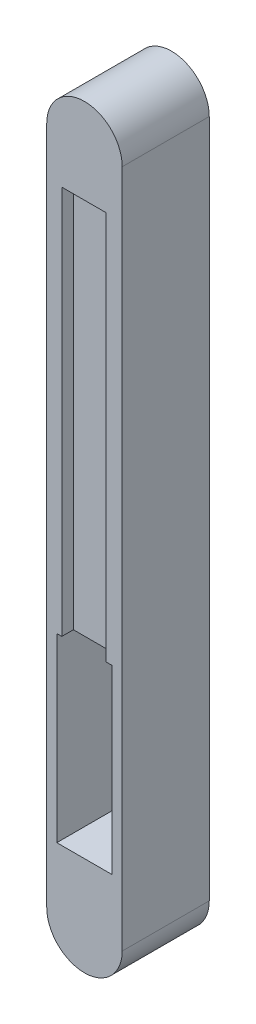
ISO-10303-21;
HEADER;
FILE_DESCRIPTION(('STEP AP214'),'2;1');
FILE_NAME('part.step','',(''),(''),'','','');
FILE_SCHEMA(('AUTOMOTIVE_DESIGN { 1 0 10303 214 1 1 1 1 }'));
ENDSEC;
DATA;
#1=APPLICATION_CONTEXT('core data for automotive mechanical design processes');
#2=APPLICATION_PROTOCOL_DEFINITION('international standard','automotive_design',2000,#1);
#3=PRODUCT_CONTEXT('',#1,'mechanical');
#4=PRODUCT('Part','Part','',(#3));
#5=PRODUCT_RELATED_PRODUCT_CATEGORY('part','',(#4));
#6=PRODUCT_DEFINITION_FORMATION('','',#4);
#7=PRODUCT_DEFINITION_CONTEXT('part definition',#1,'design');
#8=PRODUCT_DEFINITION('design','',#6,#7);
#9=PRODUCT_DEFINITION_SHAPE('','',#8);
#10=(LENGTH_UNIT() NAMED_UNIT(*) SI_UNIT(.MILLI.,.METRE.));
#11=(NAMED_UNIT(*) PLANE_ANGLE_UNIT() SI_UNIT($,.RADIAN.));
#12=(NAMED_UNIT(*) SI_UNIT($,.STERADIAN.) SOLID_ANGLE_UNIT());
#13=UNCERTAINTY_MEASURE_WITH_UNIT(LENGTH_MEASURE(1.E-05),#10,'distance_accuracy_value','');
#14=(GEOMETRIC_REPRESENTATION_CONTEXT(3) GLOBAL_UNCERTAINTY_ASSIGNED_CONTEXT((#13)) GLOBAL_UNIT_ASSIGNED_CONTEXT((#10,
#11,#12)) REPRESENTATION_CONTEXT('',''));
#15=CARTESIAN_POINT('',(0.,0.,0.));
#16=DIRECTION('',(0.,0.,1.));
#17=DIRECTION('',(1.,0.,0.));
#18=AXIS2_PLACEMENT_3D('',#15,#16,#17);
#19=CARTESIAN_POINT('',(-4.4030818648567,46.7518362911079,15.));
#20=DIRECTION('',(-1.,0.,0.));
#21=DIRECTION('',(0.,-1.,0.));
#22=AXIS2_PLACEMENT_3D('',#19,#20,#21);
#23=PLANE('',#22);
#24=DIRECTION('',(0.,0.,1.));
#25=VECTOR('',#24,1.);
#26=CARTESIAN_POINT('',(-4.4030818648567,46.7518362911079,15.));
#27=LINE('',#26,#25);
#28=CARTESIAN_POINT('',(-4.4030818648567,46.7518362911079,15.));
#29=VERTEX_POINT('',#28);
#30=CARTESIAN_POINT('',(-4.4030818648567,46.7518362911079,17.2993525225217));
#31=VERTEX_POINT('',#30);
#32=EDGE_CURVE('E198',#29,#31,#27,.T.);
#33=ORIENTED_EDGE('',*,*,#32,.T.);
#34=DIRECTION('',(0.,-1.,0.));
#35=VECTOR('',#34,1.);
#36=CARTESIAN_POINT('',(-4.4030818648567,46.7518362911079,17.2993525225217));
#37=LINE('',#36,#35);
#38=CARTESIAN_POINT('',(-4.40308186485671,-30.5781994450934,17.2993525225217));
#39=VERTEX_POINT('',#38);
#40=EDGE_CURVE('E275',#31,#39,#37,.T.);
#41=ORIENTED_EDGE('',*,*,#40,.T.);
#42=DIRECTION('',(0.,0.,1.));
#43=VECTOR('',#42,1.);
#44=CARTESIAN_POINT('',(-4.40308186485671,-30.5781994450934,40.));
#45=LINE('',#44,#43);
#46=CARTESIAN_POINT('',(-4.40308186485672,-30.5781994450934,15.));
#47=VERTEX_POINT('',#46);
#48=EDGE_CURVE('E206',#47,#39,#45,.T.);
#49=ORIENTED_EDGE('',*,*,#48,.F.);
#50=DIRECTION('',(0.,-1.,0.));
#51=VECTOR('',#50,1.);
#52=CARTESIAN_POINT('',(-4.40308186485671,-46.7518362911079,15.));
#53=LINE('',#52,#51);
#54=EDGE_CURVE('E142',#29,#47,#53,.T.);
#55=ORIENTED_EDGE('',*,*,#54,.F.);
#56=EDGE_LOOP('',(#33,#41,#49,#55));
#57=FACE_BOUND('',#56,.T.);
#58=ADVANCED_FACE('F45',(#57),#23,.F.);
#59=CARTESIAN_POINT('',(4.4030818648567,46.7518362911079,15.));
#60=DIRECTION('',(1.,0.,0.));
#61=DIRECTION('',(0.,1.,0.));
#62=AXIS2_PLACEMENT_3D('',#59,#60,#61);
#63=PLANE('',#62);
#64=DIRECTION('',(0.,0.,-1.));
#65=VECTOR('',#64,1.);
#66=CARTESIAN_POINT('',(4.40308186485671,-30.5781994450934,40.));
#67=LINE('',#66,#65);
#68=CARTESIAN_POINT('',(4.40308186485671,-30.5781994450934,17.2993525225217));
#69=VERTEX_POINT('',#68);
#70=CARTESIAN_POINT('',(4.40308186485672,-30.5781994450934,15.));
#71=VERTEX_POINT('',#70);
#72=EDGE_CURVE('E186',#69,#71,#67,.T.);
#73=ORIENTED_EDGE('',*,*,#72,.F.);
#74=DIRECTION('',(0.,1.,0.));
#75=VECTOR('',#74,1.);
#76=CARTESIAN_POINT('',(4.4030818648567,46.7518362911079,17.2993525225217));
#77=LINE('',#76,#75);
#78=CARTESIAN_POINT('',(4.4030818648567,46.7518362911079,17.2993525225217));
#79=VERTEX_POINT('',#78);
#80=EDGE_CURVE('E265',#69,#79,#77,.T.);
#81=ORIENTED_EDGE('',*,*,#80,.T.);
#82=DIRECTION('',(0.,0.,1.));
#83=VECTOR('',#82,1.);
#84=CARTESIAN_POINT('',(4.4030818648567,46.7518362911079,15.));
#85=LINE('',#84,#83);
#86=CARTESIAN_POINT('',(4.4030818648567,46.7518362911079,15.));
#87=VERTEX_POINT('',#86);
#88=EDGE_CURVE('E188',#87,#79,#85,.T.);
#89=ORIENTED_EDGE('',*,*,#88,.F.);
#90=DIRECTION('',(0.,1.,0.));
#91=VECTOR('',#90,1.);
#92=CARTESIAN_POINT('',(4.40308186485671,-46.7518362911079,15.));
#93=LINE('',#92,#91);
#94=EDGE_CURVE('E178',#71,#87,#93,.T.);
#95=ORIENTED_EDGE('',*,*,#94,.F.);
#96=EDGE_LOOP('',(#73,#81,#89,#95));
#97=FACE_BOUND('',#96,.T.);
#98=ADVANCED_FACE('F184',(#97),#63,.F.);
#99=CARTESIAN_POINT('',(4.4030818648567,46.7518362911079,15.));
#100=DIRECTION('',(0.,1.,0.));
#101=DIRECTION('',(0.,0.,1.));
#102=AXIS2_PLACEMENT_3D('',#99,#100,#101);
#103=PLANE('',#102);
#104=ORIENTED_EDGE('',*,*,#88,.T.);
#105=DIRECTION('',(-1.,0.,0.));
#106=VECTOR('',#105,1.);
#107=CARTESIAN_POINT('',(4.4030818648567,46.7518362911079,17.2993525225217));
#108=LINE('',#107,#106);
#109=EDGE_CURVE('E270',#79,#31,#108,.T.);
#110=ORIENTED_EDGE('',*,*,#109,.T.);
#111=ORIENTED_EDGE('',*,*,#32,.F.);
#112=DIRECTION('',(-1.,0.,0.));
#113=VECTOR('',#112,1.);
#114=CARTESIAN_POINT('',(4.4030818648567,46.7518362911079,15.));
#115=LINE('',#114,#113);
#116=EDGE_CURVE('E191',#87,#29,#115,.T.);
#117=ORIENTED_EDGE('',*,*,#116,.F.);
#118=EDGE_LOOP('',(#104,#110,#111,#117));
#119=FACE_BOUND('',#118,.T.);
#120=ADVANCED_FACE('F306',(#119),#103,.F.);
#121=CARTESIAN_POINT('',(-7.40308186485673,56.2618005549066,135.));
#122=DIRECTION('',(1.,0.,0.));
#123=DIRECTION('',(0.,1.,0.));
#124=AXIS2_PLACEMENT_3D('',#121,#122,#123);
#125=PLANE('',#124);
#126=DIRECTION('',(0.,0.,-1.));
#127=VECTOR('',#126,1.);
#128=CARTESIAN_POINT('',(-7.40308186485672,-78.7381994450934,135.));
#129=LINE('',#128,#127);
#130=CARTESIAN_POINT('',(-7.40308186485672,-78.7381994450934,17.2993525225217));
#131=VERTEX_POINT('',#130);
#132=CARTESIAN_POINT('',(-7.40308186485672,-78.7381994450934,0.));
#133=VERTEX_POINT('',#132);
#134=EDGE_CURVE('E161',#131,#133,#129,.T.);
#135=ORIENTED_EDGE('',*,*,#134,.F.);
#136=DIRECTION('',(0.,1.,0.));
#137=VECTOR('',#136,1.);
#138=CARTESIAN_POINT('',(-7.40308186485673,56.2618005549066,17.2993525225217));
#139=LINE('',#138,#137);
#140=CARTESIAN_POINT('',(-7.40308186485673,56.2618005549066,17.2993525225217));
#141=VERTEX_POINT('',#140);
#142=EDGE_CURVE('E143',#131,#141,#139,.T.);
#143=ORIENTED_EDGE('',*,*,#142,.T.);
#144=DIRECTION('',(0.,0.,-1.));
#145=VECTOR('',#144,1.);
#146=CARTESIAN_POINT('',(-7.40308186485673,56.2618005549066,135.));
#147=LINE('',#146,#145);
#148=CARTESIAN_POINT('',(-7.40308186485673,56.2618005549066,0.));
#149=VERTEX_POINT('',#148);
#150=EDGE_CURVE('E139',#141,#149,#147,.T.);
#151=ORIENTED_EDGE('',*,*,#150,.T.);
#152=DIRECTION('',(0.,-1.,0.));
#153=VECTOR('',#152,1.);
#154=CARTESIAN_POINT('',(-7.40308186485673,56.2618005549066,0.));
#155=LINE('',#154,#153);
#156=EDGE_CURVE('E248',#149,#133,#155,.T.);
#157=ORIENTED_EDGE('',*,*,#156,.T.);
#158=EDGE_LOOP('',(#135,#143,#151,#157));
#159=FACE_BOUND('',#158,.T.);
#160=ADVANCED_FACE('F261',(#159),#125,.F.);
#161=CARTESIAN_POINT('',(0.0969181351432745,56.2618005549066,135.));
#162=DIRECTION('',(0.,0.,-1.));
#163=DIRECTION('',(-1.,0.,0.));
#164=AXIS2_PLACEMENT_3D('',#161,#162,#163);
#165=CYLINDRICAL_SURFACE('',#164,7.5);
#166=CARTESIAN_POINT('',(0.0969181351432745,56.2618005549066,17.2993525225217));
#167=DIRECTION('',(0.,0.,-1.));
#168=DIRECTION('',(-1.,0.,0.));
#169=AXIS2_PLACEMENT_3D('',#166,#167,#168);
#170=CIRCLE('',#169,7.5);
#171=CARTESIAN_POINT('',(7.59691813514327,56.2618005549066,17.2993525225217));
#172=VERTEX_POINT('',#171);
#173=EDGE_CURVE('E134',#141,#172,#170,.T.);
#174=ORIENTED_EDGE('',*,*,#173,.T.);
#175=DIRECTION('',(0.,0.,-1.));
#176=VECTOR('',#175,1.);
#177=CARTESIAN_POINT('',(7.59691813514327,56.2618005549066,135.));
#178=LINE('',#177,#176);
#179=CARTESIAN_POINT('',(7.59691813514327,56.2618005549066,0.));
#180=VERTEX_POINT('',#179);
#181=EDGE_CURVE('E137',#172,#180,#178,.T.);
#182=ORIENTED_EDGE('',*,*,#181,.T.);
#183=CARTESIAN_POINT('',(0.0969181351432745,56.2618005549066,0.));
#184=DIRECTION('',(0.,0.,1.));
#185=DIRECTION('',(1.,0.,0.));
#186=AXIS2_PLACEMENT_3D('',#183,#184,#185);
#187=CIRCLE('',#186,7.5);
#188=EDGE_CURVE('E242',#180,#149,#187,.T.);
#189=ORIENTED_EDGE('',*,*,#188,.T.);
#190=ORIENTED_EDGE('',*,*,#150,.F.);
#191=EDGE_LOOP('',(#174,#182,#189,#190));
#192=FACE_BOUND('',#191,.T.);
#193=ADVANCED_FACE('F47',(#192),#165,.T.);
#194=CARTESIAN_POINT('',(0.0969181351432745,-78.7381994450934,135.));
#195=DIRECTION('',(0.,0.,-1.));
#196=DIRECTION('',(-1.,0.,0.));
#197=AXIS2_PLACEMENT_3D('',#194,#195,#196);
#198=CYLINDRICAL_SURFACE('',#197,7.5);
#199=DIRECTION('',(0.,0.,-1.));
#200=VECTOR('',#199,1.);
#201=CARTESIAN_POINT('',(7.59691813514327,-78.7381994450934,135.));
#202=LINE('',#201,#200);
#203=CARTESIAN_POINT('',(7.59691813514327,-78.7381994450934,17.2993525225217));
#204=VERTEX_POINT('',#203);
#205=CARTESIAN_POINT('',(7.59691813514327,-78.7381994450934,0.));
#206=VERTEX_POINT('',#205);
#207=EDGE_CURVE('E157',#204,#206,#202,.T.);
#208=ORIENTED_EDGE('',*,*,#207,.F.);
#209=CARTESIAN_POINT('',(0.0969181351432745,-78.7381994450934,17.2993525225217));
#210=DIRECTION('',(0.,0.,-1.));
#211=DIRECTION('',(-1.,0.,0.));
#212=AXIS2_PLACEMENT_3D('',#209,#210,#211);
#213=CIRCLE('',#212,7.5);
#214=EDGE_CURVE('E61',#204,#131,#213,.T.);
#215=ORIENTED_EDGE('',*,*,#214,.T.);
#216=ORIENTED_EDGE('',*,*,#134,.T.);
#217=CARTESIAN_POINT('',(0.0969181351432745,-78.7381994450934,0.));
#218=DIRECTION('',(0.,0.,1.));
#219=DIRECTION('',(-1.,0.,0.));
#220=AXIS2_PLACEMENT_3D('',#217,#218,#219);
#221=CIRCLE('',#220,7.5);
#222=EDGE_CURVE('E163',#133,#206,#221,.T.);
#223=ORIENTED_EDGE('',*,*,#222,.T.);
#224=EDGE_LOOP('',(#208,#215,#216,#223));
#225=FACE_BOUND('',#224,.T.);
#226=ADVANCED_FACE('F255',(#225),#198,.T.);
#227=CARTESIAN_POINT('',(7.59691813514327,56.2618005549066,135.));
#228=DIRECTION('',(-1.,0.,0.));
#229=DIRECTION('',(0.,-1.,0.));
#230=AXIS2_PLACEMENT_3D('',#227,#228,#229);
#231=PLANE('',#230);
#232=ORIENTED_EDGE('',*,*,#181,.F.);
#233=DIRECTION('',(0.,1.,0.));
#234=VECTOR('',#233,1.);
#235=CARTESIAN_POINT('',(7.59691813514327,63.7618005549066,17.2993525225217));
#236=LINE('',#235,#234);
#237=EDGE_CURVE('E145',#204,#172,#236,.T.);
#238=ORIENTED_EDGE('',*,*,#237,.F.);
#239=ORIENTED_EDGE('',*,*,#207,.T.);
#240=DIRECTION('',(0.,1.,0.));
#241=VECTOR('',#240,1.);
#242=CARTESIAN_POINT('',(7.59691813514327,56.2618005549066,0.));
#243=LINE('',#242,#241);
#244=EDGE_CURVE('E154',#206,#180,#243,.T.);
#245=ORIENTED_EDGE('',*,*,#244,.T.);
#246=EDGE_LOOP('',(#232,#238,#239,#245));
#247=FACE_BOUND('',#246,.T.);
#248=ADVANCED_FACE('F152',(#247),#231,.F.);
#249=CARTESIAN_POINT('',(0.0969181351432745,56.2618005549066,0.));
#250=DIRECTION('',(0.,0.,1.));
#251=DIRECTION('',(1.,0.,0.));
#252=AXIS2_PLACEMENT_3D('',#249,#250,#251);
#253=PLANE('',#252);
#254=DIRECTION('',(-1.,0.,0.));
#255=VECTOR('',#254,1.);
#256=CARTESIAN_POINT('',(5.59691813514327,-66.5781994450934,0.));
#257=LINE('',#256,#255);
#258=CARTESIAN_POINT('',(5.59691813514327,-66.5781994450934,0.));
#259=VERTEX_POINT('',#258);
#260=CARTESIAN_POINT('',(-5.40308186485673,-66.5781994450934,0.));
#261=VERTEX_POINT('',#260);
#262=EDGE_CURVE('E213',#259,#261,#257,.T.);
#263=ORIENTED_EDGE('',*,*,#262,.F.);
#264=DIRECTION('',(0.,-1.,0.));
#265=VECTOR('',#264,1.);
#266=CARTESIAN_POINT('',(5.59691813514327,-66.5781994450934,0.));
#267=LINE('',#266,#265);
#268=CARTESIAN_POINT('',(5.59691813514327,-30.5781994450934,0.));
#269=VERTEX_POINT('',#268);
#270=EDGE_CURVE('E209',#269,#259,#267,.T.);
#271=ORIENTED_EDGE('',*,*,#270,.F.);
#272=DIRECTION('',(1.,0.,0.));
#273=VECTOR('',#272,1.);
#274=CARTESIAN_POINT('',(-5.40308186485673,-30.5781994450934,0.));
#275=LINE('',#274,#273);
#276=CARTESIAN_POINT('',(-5.40308186485673,-30.5781994450934,0.));
#277=VERTEX_POINT('',#276);
#278=EDGE_CURVE('E221',#277,#269,#275,.T.);
#279=ORIENTED_EDGE('',*,*,#278,.F.);
#280=DIRECTION('',(0.,1.,0.));
#281=VECTOR('',#280,1.);
#282=CARTESIAN_POINT('',(-5.40308186485673,-66.5781994450934,0.));
#283=LINE('',#282,#281);
#284=EDGE_CURVE('E217',#261,#277,#283,.T.);
#285=ORIENTED_EDGE('',*,*,#284,.F.);
#286=EDGE_LOOP('',(#263,#271,#279,#285));
#287=FACE_BOUND('',#286,.T.);
#288=CARTESIAN_POINT('',(0.0969181351432743,54.7618005549066,0.));
#289=DIRECTION('',(0.,0.,-1.));
#290=DIRECTION('',(-1.,0.,0.));
#291=AXIS2_PLACEMENT_3D('',#288,#289,#290);
#292=CIRCLE('',#291,3.5);
#293=CARTESIAN_POINT('',(-3.40308186485673,54.7618005549066,0.));
#294=VERTEX_POINT('',#293);
#295=EDGE_CURVE('E229',#294,#294,#292,.T.);
#296=ORIENTED_EDGE('',*,*,#295,.F.);
#297=EDGE_LOOP('',(#296));
#298=FACE_BOUND('',#297,.T.);
#299=ORIENTED_EDGE('',*,*,#188,.F.);
#300=ORIENTED_EDGE('',*,*,#244,.F.);
#301=ORIENTED_EDGE('',*,*,#222,.F.);
#302=ORIENTED_EDGE('',*,*,#156,.F.);
#303=EDGE_LOOP('',(#299,#300,#301,#302));
#304=FACE_BOUND('',#303,.T.);
#305=ADVANCED_FACE('F259',(#287,#298,#304),#253,.F.);
#306=CARTESIAN_POINT('',(0.0969181351432743,54.7618005549066,10.));
#307=DIRECTION('',(0.,0.,-1.));
#308=DIRECTION('',(-1.,0.,0.));
#309=AXIS2_PLACEMENT_3D('',#306,#307,#308);
#310=CYLINDRICAL_SURFACE('',#309,3.5);
#311=CARTESIAN_POINT('',(0.0969181351432743,54.7618005549066,10.));
#312=DIRECTION('',(0.,0.,-1.));
#313=DIRECTION('',(-1.,0.,0.));
#314=AXIS2_PLACEMENT_3D('',#311,#312,#313);
#315=CIRCLE('',#314,3.5);
#316=CARTESIAN_POINT('',(-3.40308186485673,54.7618005549066,10.));
#317=VERTEX_POINT('',#316);
#318=EDGE_CURVE('E238',#317,#317,#315,.T.);
#319=ORIENTED_EDGE('',*,*,#318,.F.);
#320=EDGE_LOOP('',(#319));
#321=FACE_BOUND('',#320,.T.);
#322=ORIENTED_EDGE('',*,*,#295,.T.);
#323=EDGE_LOOP('',(#322));
#324=FACE_BOUND('',#323,.T.);
#325=ADVANCED_FACE('F319',(#321,#324),#310,.F.);
#326=CARTESIAN_POINT('',(0.0969181351432743,54.7618005549066,10.));
#327=DIRECTION('',(0.,0.,-1.));
#328=DIRECTION('',(-1.,0.,0.));
#329=AXIS2_PLACEMENT_3D('',#326,#327,#328);
#330=PLANE('',#329);
#331=ORIENTED_EDGE('',*,*,#318,.T.);
#332=EDGE_LOOP('',(#331));
#333=FACE_BOUND('',#332,.T.);
#334=ADVANCED_FACE('F311',(#333),#330,.T.);
#335=CARTESIAN_POINT('',(5.59691813514327,-66.5781994450934,40.));
#336=DIRECTION('',(1.,0.,0.));
#337=DIRECTION('',(0.,1.,0.));
#338=AXIS2_PLACEMENT_3D('',#335,#336,#337);
#339=PLANE('',#338);
#340=DIRECTION('',(0.,0.,-1.));
#341=VECTOR('',#340,1.);
#342=CARTESIAN_POINT('',(5.59691813514327,-66.5781994450934,40.));
#343=LINE('',#342,#341);
#344=CARTESIAN_POINT('',(5.59691813514327,-66.5781994450934,17.2993525225217));
#345=VERTEX_POINT('',#344);
#346=EDGE_CURVE('E225',#345,#259,#343,.T.);
#347=ORIENTED_EDGE('',*,*,#346,.F.);
#348=DIRECTION('',(0.,1.,0.));
#349=VECTOR('',#348,1.);
#350=CARTESIAN_POINT('',(5.59691813514327,-66.5781994450934,17.2993525225217));
#351=LINE('',#350,#349);
#352=CARTESIAN_POINT('',(5.59691813514327,-30.5781994450934,17.2993525225217));
#353=VERTEX_POINT('',#352);
#354=EDGE_CURVE('E69',#345,#353,#351,.T.);
#355=ORIENTED_EDGE('',*,*,#354,.T.);
#356=DIRECTION('',(0.,0.,-1.));
#357=VECTOR('',#356,1.);
#358=CARTESIAN_POINT('',(5.59691813514327,-30.5781994450934,40.));
#359=LINE('',#358,#357);
#360=EDGE_CURVE('E226',#353,#269,#359,.T.);
#361=ORIENTED_EDGE('',*,*,#360,.T.);
#362=ORIENTED_EDGE('',*,*,#270,.T.);
#363=EDGE_LOOP('',(#347,#355,#361,#362));
#364=FACE_BOUND('',#363,.T.);
#365=ADVANCED_FACE('F309',(#364),#339,.F.);
#366=CARTESIAN_POINT('',(-5.40308186485673,-30.5781994450934,40.));
#367=DIRECTION('',(0.,1.,0.));
#368=DIRECTION('',(0.,0.,1.));
#369=AXIS2_PLACEMENT_3D('',#366,#367,#368);
#370=PLANE('',#369);
#371=ORIENTED_EDGE('',*,*,#360,.F.);
#372=DIRECTION('',(-1.,0.,0.));
#373=VECTOR('',#372,1.);
#374=CARTESIAN_POINT('',(-5.40308186485673,-30.5781994450934,17.2993525225217));
#375=LINE('',#374,#373);
#376=EDGE_CURVE('E274',#353,#69,#375,.T.);
#377=ORIENTED_EDGE('',*,*,#376,.T.);
#378=ORIENTED_EDGE('',*,*,#72,.T.);
#379=DIRECTION('',(1.,0.,0.));
#380=VECTOR('',#379,1.);
#381=CARTESIAN_POINT('',(-5.40308186485673,-30.5781994450934,15.));
#382=LINE('',#381,#380);
#383=EDGE_CURVE('E54',#47,#71,#382,.T.);
#384=ORIENTED_EDGE('',*,*,#383,.F.);
#385=ORIENTED_EDGE('',*,*,#48,.T.);
#386=CARTESIAN_POINT('',(-5.40308186485673,-30.5781994450934,17.2993525225217));
#387=VERTEX_POINT('',#386);
#388=EDGE_CURVE('E281',#39,#387,#375,.T.);
#389=ORIENTED_EDGE('',*,*,#388,.T.);
#390=DIRECTION('',(0.,0.,-1.));
#391=VECTOR('',#390,1.);
#392=CARTESIAN_POINT('',(-5.40308186485673,-30.5781994450934,40.));
#393=LINE('',#392,#391);
#394=EDGE_CURVE('E230',#387,#277,#393,.T.);
#395=ORIENTED_EDGE('',*,*,#394,.T.);
#396=ORIENTED_EDGE('',*,*,#278,.T.);
#397=EDGE_LOOP('',(#371,#377,#378,#384,#385,#389,#395,#396));
#398=FACE_BOUND('',#397,.T.);
#399=ADVANCED_FACE('F301',(#398),#370,.F.);
#400=CARTESIAN_POINT('',(-5.40308186485673,-66.5781994450934,40.));
#401=DIRECTION('',(-1.,0.,0.));
#402=DIRECTION('',(0.,0.,1.));
#403=AXIS2_PLACEMENT_3D('',#400,#401,#402);
#404=PLANE('',#403);
#405=ORIENTED_EDGE('',*,*,#394,.F.);
#406=DIRECTION('',(0.,-1.,0.));
#407=VECTOR('',#406,1.);
#408=CARTESIAN_POINT('',(-5.40308186485673,-66.5781994450934,17.2993525225217));
#409=LINE('',#408,#407);
#410=CARTESIAN_POINT('',(-5.40308186485673,-66.5781994450934,17.2993525225217));
#411=VERTEX_POINT('',#410);
#412=EDGE_CURVE('E150',#387,#411,#409,.T.);
#413=ORIENTED_EDGE('',*,*,#412,.T.);
#414=DIRECTION('',(0.,0.,-1.));
#415=VECTOR('',#414,1.);
#416=CARTESIAN_POINT('',(-5.40308186485673,-66.5781994450934,40.));
#417=LINE('',#416,#415);
#418=EDGE_CURVE('E233',#411,#261,#417,.T.);
#419=ORIENTED_EDGE('',*,*,#418,.T.);
#420=ORIENTED_EDGE('',*,*,#284,.T.);
#421=EDGE_LOOP('',(#405,#413,#419,#420));
#422=FACE_BOUND('',#421,.T.);
#423=ADVANCED_FACE('F290',(#422),#404,.F.);
#424=CARTESIAN_POINT('',(5.59691813514327,-66.5781994450934,40.));
#425=DIRECTION('',(0.,-1.,0.));
#426=DIRECTION('',(0.,0.,-1.));
#427=AXIS2_PLACEMENT_3D('',#424,#425,#426);
#428=PLANE('',#427);
#429=ORIENTED_EDGE('',*,*,#418,.F.);
#430=DIRECTION('',(1.,0.,0.));
#431=VECTOR('',#430,1.);
#432=CARTESIAN_POINT('',(5.59691813514327,-66.5781994450934,17.2993525225217));
#433=LINE('',#432,#431);
#434=EDGE_CURVE('E11',#411,#345,#433,.T.);
#435=ORIENTED_EDGE('',*,*,#434,.T.);
#436=ORIENTED_EDGE('',*,*,#346,.T.);
#437=ORIENTED_EDGE('',*,*,#262,.T.);
#438=EDGE_LOOP('',(#429,#435,#436,#437));
#439=FACE_BOUND('',#438,.T.);
#440=ADVANCED_FACE('F292',(#439),#428,.F.);
#441=CARTESIAN_POINT('',(0.,0.,15.));
#442=DIRECTION('',(0.,0.,1.));
#443=DIRECTION('',(1.,0.,0.));
#444=AXIS2_PLACEMENT_3D('',#441,#442,#443);
#445=PLANE('',#444);
#446=ORIENTED_EDGE('',*,*,#383,.T.);
#447=ORIENTED_EDGE('',*,*,#94,.T.);
#448=ORIENTED_EDGE('',*,*,#116,.T.);
#449=ORIENTED_EDGE('',*,*,#54,.T.);
#450=EDGE_LOOP('',(#446,#447,#448,#449));
#451=FACE_BOUND('',#450,.T.);
#452=ADVANCED_FACE('F176',(#451),#445,.T.);
#453=CARTESIAN_POINT('',(-33.2116102102493,63.7618005549066,17.2993525225217));
#454=DIRECTION('',(0.,0.,-1.));
#455=DIRECTION('',(-1.,0.,0.));
#456=AXIS2_PLACEMENT_3D('',#453,#454,#455);
#457=PLANE('',#456);
#458=ORIENTED_EDGE('',*,*,#376,.F.);
#459=ORIENTED_EDGE('',*,*,#354,.F.);
#460=ORIENTED_EDGE('',*,*,#434,.F.);
#461=ORIENTED_EDGE('',*,*,#412,.F.);
#462=ORIENTED_EDGE('',*,*,#388,.F.);
#463=ORIENTED_EDGE('',*,*,#40,.F.);
#464=ORIENTED_EDGE('',*,*,#109,.F.);
#465=ORIENTED_EDGE('',*,*,#80,.F.);
#466=EDGE_LOOP('',(#458,#459,#460,#461,#462,#463,#464,#465));
#467=FACE_BOUND('',#466,.T.);
#468=ORIENTED_EDGE('',*,*,#173,.F.);
#469=ORIENTED_EDGE('',*,*,#142,.F.);
#470=ORIENTED_EDGE('',*,*,#214,.F.);
#471=ORIENTED_EDGE('',*,*,#237,.T.);
#472=EDGE_LOOP('',(#468,#469,#470,#471));
#473=FACE_BOUND('',#472,.T.);
#474=ADVANCED_FACE('F146',(#467,#473),#457,.F.);
#475=CLOSED_SHELL('',(#58,#98,#120,#160,#193,#226,#248,#305,#325,#334,#365,#399,#423,#440,#452,#474));
#476=MANIFOLD_SOLID_BREP('B2',#475);
#477=ADVANCED_BREP_SHAPE_REPRESENTATION('',(#18,#476),#14);
#478=SHAPE_DEFINITION_REPRESENTATION(#9,#477);
ENDSEC;
END-ISO-10303-21;
